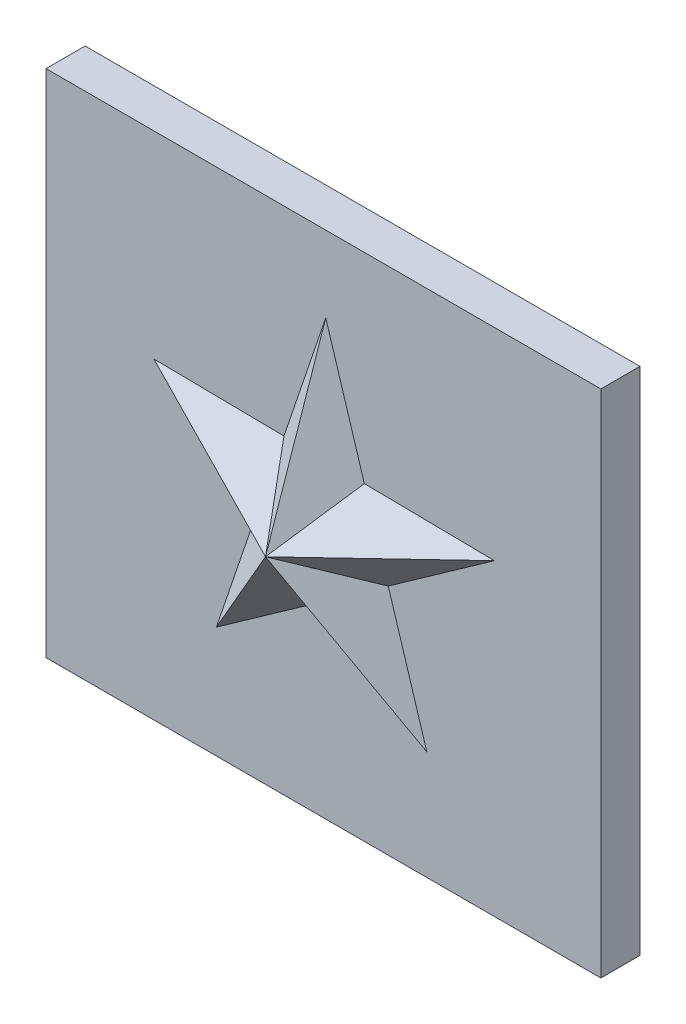
ISO-10303-21;
HEADER;
FILE_DESCRIPTION(('STEP AP214'),'2;1');
FILE_NAME('part.step','',(''),(''),'','','');
FILE_SCHEMA(('AUTOMOTIVE_DESIGN { 1 0 10303 214 1 1 1 1 }'));
ENDSEC;
DATA;
#1=APPLICATION_CONTEXT('core data for automotive mechanical design processes');
#2=APPLICATION_PROTOCOL_DEFINITION('international standard','automotive_design',2000,#1);
#3=PRODUCT_CONTEXT('',#1,'mechanical');
#4=PRODUCT('Part','Part','',(#3));
#5=PRODUCT_RELATED_PRODUCT_CATEGORY('part','',(#4));
#6=PRODUCT_DEFINITION_FORMATION('','',#4);
#7=PRODUCT_DEFINITION_CONTEXT('part definition',#1,'design');
#8=PRODUCT_DEFINITION('design','',#6,#7);
#9=PRODUCT_DEFINITION_SHAPE('','',#8);
#10=(LENGTH_UNIT() NAMED_UNIT(*) SI_UNIT(.MILLI.,.METRE.));
#11=(NAMED_UNIT(*) PLANE_ANGLE_UNIT() SI_UNIT($,.RADIAN.));
#12=(NAMED_UNIT(*) SI_UNIT($,.STERADIAN.) SOLID_ANGLE_UNIT());
#13=UNCERTAINTY_MEASURE_WITH_UNIT(LENGTH_MEASURE(1.E-05),#10,'distance_accuracy_value','');
#14=(GEOMETRIC_REPRESENTATION_CONTEXT(3) GLOBAL_UNCERTAINTY_ASSIGNED_CONTEXT((#13)) GLOBAL_UNIT_ASSIGNED_CONTEXT((#10,
#11,#12)) REPRESENTATION_CONTEXT('',''));
#15=CARTESIAN_POINT('',(0.,0.,0.));
#16=DIRECTION('',(0.,0.,1.));
#17=DIRECTION('',(1.,0.,0.));
#18=AXIS2_PLACEMENT_3D('',#15,#16,#17);
#19=CARTESIAN_POINT('',(2.11990190585049,0.658629289425786,2.11977728970235));
#20=DIRECTION('',(-0.690656187675904,-0.21457898257986,-0.690615588196486));
#21=DIRECTION('',(-0.707085997015318,0.,0.70712756474688));
#22=AXIS2_PLACEMENT_3D('',#19,#20,#21);
#23=PLANE('',#22);
#24=DIRECTION('',(-0.01229729274159,-0.951343477299267,0.307886935077417));
#25=VECTOR('',#24,1.);
#26=CARTESIAN_POINT('',(0.177515276309693,13.7329413706685,0.));
#27=LINE('',#26,#25);
#28=CARTESIAN_POINT('',(0.177515276309692,13.7329413706685,0.));
#29=VERTEX_POINT('',#28);
#30=CARTESIAN_POINT('',(0.,0.,4.44444444));
#31=VERTEX_POINT('',#30);
#32=EDGE_CURVE('E400',#29,#31,#27,.T.);
#33=ORIENTED_EDGE('',*,*,#32,.T.);
#34=DIRECTION('',(-0.456413605920561,-0.611421652011181,0.646413322714274));
#35=VECTOR('',#34,1.);
#36=CARTESIAN_POINT('',(3.13809267521954,4.2038576036247,0.));
#37=LINE('',#36,#35);
#38=CARTESIAN_POINT('',(3.13809267521954,4.2038576036247,0.));
#39=VERTEX_POINT('',#38);
#40=EDGE_CURVE('E65',#39,#31,#37,.T.);
#41=ORIENTED_EDGE('',*,*,#40,.F.);
#42=DIRECTION('',(-0.296698624658093,0.954971165075677,0.));
#43=VECTOR('',#42,1.);
#44=CARTESIAN_POINT('',(3.13809267521954,4.2038576036247,0.));
#45=LINE('',#44,#43);
#46=EDGE_CURVE('E401',#39,#29,#45,.T.);
#47=ORIENTED_EDGE('',*,*,#46,.T.);
#48=EDGE_LOOP('',(#33,#41,#47));
#49=FACE_BOUND('',#48,.T.);
#50=ADVANCED_FACE('F46',(#49),#23,.F.);
#51=CARTESIAN_POINT('',(0.0286920377843989,2.21967416489128,2.11977728970235));
#52=DIRECTION('',(-0.00934775961950741,-0.7231616200616,-0.690615588196486));
#53=DIRECTION('',(0.,0.690645763379698,-0.723193217284063));
#54=AXIS2_PLACEMENT_3D('',#51,#52,#53);
#55=PLANE('',#54);
#56=ORIENTED_EDGE('',*,*,#40,.T.);
#57=DIRECTION('',(-0.908581485762314,-0.282285881578552,0.307886935077417));
#58=VECTOR('',#57,1.);
#59=CARTESIAN_POINT('',(13.1156586156144,4.07488520601509,0.));
#60=LINE('',#59,#58);
#61=CARTESIAN_POINT('',(13.1156586156144,4.07488520601509,0.));
#62=VERTEX_POINT('',#61);
#63=EDGE_CURVE('E12',#62,#31,#60,.T.);
#64=ORIENTED_EDGE('',*,*,#63,.F.);
#65=DIRECTION('',(-0.999916466646222,0.0129251587895385,0.));
#66=VECTOR('',#65,1.);
#67=CARTESIAN_POINT('',(3.13809267521954,4.2038576036247,0.));
#68=LINE('',#67,#66);
#69=EDGE_CURVE('E309',#62,#39,#68,.T.);
#70=ORIENTED_EDGE('',*,*,#69,.T.);
#71=EDGE_LOOP('',(#56,#64,#70));
#72=FACE_BOUND('',#71,.T.);
#73=ADVANCED_FACE('F315',(#72),#55,.F.);
#74=CARTESIAN_POINT('',(-2.10216925129323,0.713204788427065,2.11977728970235));
#75=DIRECTION('',(0.684878954512385,-0.232359477977647,-0.690615588196486));
#76=DIRECTION('',(-0.710049663513221,0.,-0.704151599689131));
#77=AXIS2_PLACEMENT_3D('',#74,#75,#76);
#78=PLANE('',#77);
#79=DIRECTION('',(0.440456985655778,-0.623014815236778,0.646413322714274));
#80=VECTOR('',#79,1.);
#81=CARTESIAN_POINT('',(-3.02838220093782,4.28356692895801,0.));
#82=LINE('',#81,#80);
#83=CARTESIAN_POINT('',(-3.02838220093782,4.28356692895801,0.));
#84=VERTEX_POINT('',#83);
#85=EDGE_CURVE('E341',#84,#31,#82,.T.);
#86=ORIENTED_EDGE('',*,*,#85,.T.);
#87=ORIENTED_EDGE('',*,*,#32,.F.);
#88=DIRECTION('',(-0.321283737639973,-0.946982977633753,0.));
#89=VECTOR('',#88,1.);
#90=CARTESIAN_POINT('',(0.177515276309693,13.7329413706685,0.));
#91=LINE('',#90,#89);
#92=EDGE_CURVE('E404',#29,#84,#91,.T.);
#93=ORIENTED_EDGE('',*,*,#92,.T.);
#94=EDGE_LOOP('',(#86,#87,#93));
#95=FACE_BOUND('',#94,.T.);
#96=ADVANCED_FACE('F325',(#95),#78,.F.);
#97=CARTESIAN_POINT('',(0.0286920377843992,2.21967416489128,2.11977728970235));
#98=DIRECTION('',(-0.00934775961950748,-0.7231616200616,-0.690615588196486));
#99=DIRECTION('',(0.,0.690645763379698,-0.723193217284063));
#100=AXIS2_PLACEMENT_3D('',#97,#98,#99);
#101=PLANE('',#100);
#102=DIRECTION('',(0.900981340878404,-0.305676722367909,0.307886935077417));
#103=VECTOR('',#102,1.);
#104=CARTESIAN_POINT('',(-13.0059481413327,4.41253932656762,0.));
#105=LINE('',#104,#103);
#106=CARTESIAN_POINT('',(-13.0059481413327,4.41253932656762,0.));
#107=VERTEX_POINT('',#106);
#108=EDGE_CURVE('E349',#107,#31,#105,.T.);
#109=ORIENTED_EDGE('',*,*,#108,.T.);
#110=ORIENTED_EDGE('',*,*,#85,.F.);
#111=DIRECTION('',(-0.999916466646222,0.0129251587895386,0.));
#112=VECTOR('',#111,1.);
#113=CARTESIAN_POINT('',(-13.0059481413327,4.41253932656762,0.));
#114=LINE('',#113,#112);
#115=EDGE_CURVE('E357',#84,#107,#114,.T.);
#116=ORIENTED_EDGE('',*,*,#115,.T.);
#117=EDGE_LOOP('',(#109,#110,#116));
#118=FACE_BOUND('',#117,.T.);
#119=ADVANCED_FACE('F331',(#118),#101,.F.);
#120=CARTESIAN_POINT('',(-1.32790408518854,-1.77888936470418,2.11977728970235));
#121=DIRECTION('',(0.432626231687655,0.579555565063231,-0.690615588196486));
#122=DIRECTION('',(0.,0.766011519703359,0.642826844244817));
#123=AXIS2_PLACEMENT_3D('',#120,#121,#122);
#124=PLANE('',#123);
#125=DIRECTION('',(0.728630993638157,0.226377320700117,0.646413322714275));
#126=VECTOR('',#125,1.);
#127=CARTESIAN_POINT('',(-5.00973580632432,-1.55646764844365,0.));
#128=LINE('',#127,#126);
#129=CARTESIAN_POINT('',(-5.00973580632433,-1.55646764844365,0.));
#130=VERTEX_POINT('',#129);
#131=EDGE_CURVE('E368',#130,#31,#128,.T.);
#132=ORIENTED_EDGE('',*,*,#131,.T.);
#133=ORIENTED_EDGE('',*,*,#108,.F.);
#134=DIRECTION('',(0.801352196752115,-0.598192825734779,0.));
#135=VECTOR('',#134,1.);
#136=CARTESIAN_POINT('',(-13.0059481413327,4.41253932656762,0.));
#137=LINE('',#136,#135);
#138=EDGE_CURVE('E375',#107,#130,#137,.T.);
#139=ORIENTED_EDGE('',*,*,#138,.T.);
#140=EDGE_LOOP('',(#132,#133,#139));
#141=FACE_BOUND('',#140,.T.);
#142=ADVANCED_FACE('F381',(#141),#124,.F.);
#143=CARTESIAN_POINT('',(-2.10216925129323,0.713204788427065,2.11977728970235));
#144=DIRECTION('',(0.684878954512385,-0.232359477977647,-0.690615588196486));
#145=DIRECTION('',(-0.710049663513221,0.,-0.704151599689131));
#146=AXIS2_PLACEMENT_3D('',#143,#144,#145);
#147=PLANE('',#146);
#148=DIRECTION('',(0.569134384633898,0.762424873306235,0.307886935077417));
#149=VECTOR('',#148,1.);
#150=CARTESIAN_POINT('',(-8.21563328357183,-11.0058420901542,0.));
#151=LINE('',#150,#149);
#152=CARTESIAN_POINT('',(-8.21563328357183,-11.0058420901542,0.));
#153=VERTEX_POINT('',#152);
#154=EDGE_CURVE('E242',#153,#31,#151,.T.);
#155=ORIENTED_EDGE('',*,*,#154,.T.);
#156=ORIENTED_EDGE('',*,*,#131,.F.);
#157=DIRECTION('',(-0.321283737639973,-0.946982977633753,0.));
#158=VECTOR('',#157,1.);
#159=CARTESIAN_POINT('',(-5.00973580632432,-1.55646764844365,0.));
#160=LINE('',#159,#158);
#161=EDGE_CURVE('E407',#130,#153,#160,.T.);
#162=ORIENTED_EDGE('',*,*,#161,.T.);
#163=EDGE_LOOP('',(#155,#156,#162));
#164=FACE_BOUND('',#163,.T.);
#165=ADVANCED_FACE('F255',(#164),#147,.F.);
#166=CARTESIAN_POINT('',(1.28147939284688,-1.81261887803996,2.11977728970235));
#167=DIRECTION('',(-0.417501238904627,0.590544515555874,-0.690615588196487));
#168=DIRECTION('',(0.,0.760023726262173,0.649895326586184));
#169=AXIS2_PLACEMENT_3D('',#166,#167,#168);
#170=PLANE('',#169);
#171=DIRECTION('',(0.00986173366921,0.762923693711586,0.646413322714274));
#172=VECTOR('',#171,1.);
#173=CARTESIAN_POINT('',(-0.0678048020279662,-5.24551683808581,0.));
#174=LINE('',#173,#172);
#175=CARTESIAN_POINT('',(-0.0678048020279662,-5.24551683808581,0.));
#176=VERTEX_POINT('',#175);
#177=EDGE_CURVE('E277',#176,#31,#174,.T.);
#178=ORIENTED_EDGE('',*,*,#177,.T.);
#179=ORIENTED_EDGE('',*,*,#154,.F.);
#180=DIRECTION('',(0.816546632192173,0.577279479503316,0.));
#181=VECTOR('',#180,1.);
#182=CARTESIAN_POINT('',(-0.0678048020279662,-5.24551683808581,0.));
#183=LINE('',#182,#181);
#184=EDGE_CURVE('E237',#153,#176,#183,.T.);
#185=ORIENTED_EDGE('',*,*,#184,.T.);
#186=EDGE_LOOP('',(#178,#179,#185));
#187=FACE_BOUND('',#186,.T.);
#188=ADVANCED_FACE('F244',(#187),#170,.F.);
#189=CARTESIAN_POINT('',(-1.32790408518853,-1.77888936470418,2.11977728970235));
#190=DIRECTION('',(0.432626231687655,0.579555565063231,-0.690615588196486));
#191=DIRECTION('',(0.,0.766011519703359,0.642826844244817));
#192=AXIS2_PLACEMENT_3D('',#189,#190,#191);
#193=PLANE('',#192);
#194=DIRECTION('',(-0.549236947008399,0.776881207939494,0.307886935077417));
#195=VECTOR('',#194,1.);
#196=CARTESIAN_POINT('',(7.92840753298043,-11.2145238130971,0.));
#197=LINE('',#196,#195);
#198=CARTESIAN_POINT('',(7.92840753298043,-11.2145238130971,0.));
#199=VERTEX_POINT('',#198);
#200=EDGE_CURVE('E269',#199,#31,#197,.T.);
#201=ORIENTED_EDGE('',*,*,#200,.T.);
#202=ORIENTED_EDGE('',*,*,#177,.F.);
#203=DIRECTION('',(0.801352196752115,-0.59819282573478,0.));
#204=VECTOR('',#203,1.);
#205=CARTESIAN_POINT('',(-0.0678048020279662,-5.24551683808581,0.));
#206=LINE('',#205,#204);
#207=EDGE_CURVE('E151',#176,#199,#206,.T.);
#208=ORIENTED_EDGE('',*,*,#207,.T.);
#209=EDGE_LOOP('',(#201,#202,#208));
#210=FACE_BOUND('',#209,.T.);
#211=ADVANCED_FACE('F254',(#210),#193,.F.);
#212=CARTESIAN_POINT('',(2.11990190585048,0.658629289425786,2.11977728970235));
#213=DIRECTION('',(-0.690656187675904,-0.21457898257986,-0.690615588196486));
#214=DIRECTION('',(-0.707085997015318,0.,0.70712756474688));
#215=AXIS2_PLACEMENT_3D('',#212,#213,#214);
#216=PLANE('',#215);
#217=DIRECTION('',(-0.722536107042586,0.245135452836258,0.646413322714274));
#218=VECTOR('',#217,1.);
#219=CARTESIAN_POINT('',(4.96783013407058,-1.68544004605326,0.));
#220=LINE('',#219,#218);
#221=CARTESIAN_POINT('',(4.96783013407058,-1.68544004605326,0.));
#222=VERTEX_POINT('',#221);
#223=EDGE_CURVE('E57',#222,#31,#220,.T.);
#224=ORIENTED_EDGE('',*,*,#223,.T.);
#225=ORIENTED_EDGE('',*,*,#200,.F.);
#226=DIRECTION('',(-0.296698624658093,0.954971165075677,0.));
#227=VECTOR('',#226,1.);
#228=CARTESIAN_POINT('',(7.92840753298043,-11.2145238130971,0.));
#229=LINE('',#228,#227);
#230=EDGE_CURVE('E154',#199,#222,#229,.T.);
#231=ORIENTED_EDGE('',*,*,#230,.T.);
#232=EDGE_LOOP('',(#224,#225,#231));
#233=FACE_BOUND('',#232,.T.);
#234=ADVANCED_FACE('F260',(#233),#216,.F.);
#235=CARTESIAN_POINT('',(1.28147939284688,-1.81261887803996,2.11977728970235));
#236=DIRECTION('',(-0.417501238904627,0.590544515555874,-0.690615588196487));
#237=DIRECTION('',(0.,0.760023726262172,0.649895326586184));
#238=AXIS2_PLACEMENT_3D('',#235,#236,#237);
#239=PLANE('',#238);
#240=ORIENTED_EDGE('',*,*,#63,.T.);
#241=ORIENTED_EDGE('',*,*,#223,.F.);
#242=DIRECTION('',(0.816546632192173,0.577279479503317,0.));
#243=VECTOR('',#242,1.);
#244=CARTESIAN_POINT('',(13.1156586156144,4.07488520601509,0.));
#245=LINE('',#244,#243);
#246=EDGE_CURVE('E51',#222,#62,#245,.T.);
#247=ORIENTED_EDGE('',*,*,#246,.T.);
#248=EDGE_LOOP('',(#240,#241,#247));
#249=FACE_BOUND('',#248,.T.);
#250=ADVANCED_FACE('F48',(#249),#239,.F.);
#251=CARTESIAN_POINT('',(21.275,-19.56,-3.));
#252=DIRECTION('',(-1.,0.,0.));
#253=DIRECTION('',(0.,0.,1.));
#254=AXIS2_PLACEMENT_3D('',#251,#252,#253);
#255=PLANE('',#254);
#256=DIRECTION('',(0.,-1.,0.));
#257=VECTOR('',#256,1.);
#258=CARTESIAN_POINT('',(21.275,-19.56,0.));
#259=LINE('',#258,#257);
#260=CARTESIAN_POINT('',(21.275,19.56,0.));
#261=VERTEX_POINT('',#260);
#262=CARTESIAN_POINT('',(21.275,-19.56,0.));
#263=VERTEX_POINT('',#262);
#264=EDGE_CURVE('E150',#261,#263,#259,.T.);
#265=ORIENTED_EDGE('',*,*,#264,.T.);
#266=DIRECTION('',(0.,0.,1.));
#267=VECTOR('',#266,1.);
#268=CARTESIAN_POINT('',(21.275,-19.56,-3.));
#269=LINE('',#268,#267);
#270=CARTESIAN_POINT('',(21.275,-19.56,-3.));
#271=VERTEX_POINT('',#270);
#272=EDGE_CURVE('E130',#271,#263,#269,.T.);
#273=ORIENTED_EDGE('',*,*,#272,.F.);
#274=DIRECTION('',(0.,-1.,0.));
#275=VECTOR('',#274,1.);
#276=CARTESIAN_POINT('',(21.275,-19.56,-3.));
#277=LINE('',#276,#275);
#278=CARTESIAN_POINT('',(21.275,19.56,-3.));
#279=VERTEX_POINT('',#278);
#280=EDGE_CURVE('E137',#279,#271,#277,.T.);
#281=ORIENTED_EDGE('',*,*,#280,.F.);
#282=DIRECTION('',(0.,0.,1.));
#283=VECTOR('',#282,1.);
#284=CARTESIAN_POINT('',(21.275,19.56,-3.));
#285=LINE('',#284,#283);
#286=EDGE_CURVE('E553',#279,#261,#285,.T.);
#287=ORIENTED_EDGE('',*,*,#286,.T.);
#288=EDGE_LOOP('',(#265,#273,#281,#287));
#289=FACE_BOUND('',#288,.T.);
#290=ADVANCED_FACE('F148',(#289),#255,.F.);
#291=CARTESIAN_POINT('',(-21.275,-19.56,-3.));
#292=DIRECTION('',(0.,1.,0.));
#293=DIRECTION('',(-1.,0.,0.));
#294=AXIS2_PLACEMENT_3D('',#291,#292,#293);
#295=PLANE('',#294);
#296=DIRECTION('',(-1.,0.,0.));
#297=VECTOR('',#296,1.);
#298=CARTESIAN_POINT('',(-21.275,-19.56,0.));
#299=LINE('',#298,#297);
#300=CARTESIAN_POINT('',(-21.275,-19.56,0.));
#301=VERTEX_POINT('',#300);
#302=EDGE_CURVE('E551',#263,#301,#299,.T.);
#303=ORIENTED_EDGE('',*,*,#302,.T.);
#304=DIRECTION('',(0.,0.,1.));
#305=VECTOR('',#304,1.);
#306=CARTESIAN_POINT('',(-21.275,-19.56,-3.));
#307=LINE('',#306,#305);
#308=CARTESIAN_POINT('',(-21.275,-19.56,-3.));
#309=VERTEX_POINT('',#308);
#310=EDGE_CURVE('E133',#309,#301,#307,.T.);
#311=ORIENTED_EDGE('',*,*,#310,.F.);
#312=DIRECTION('',(-1.,0.,0.));
#313=VECTOR('',#312,1.);
#314=CARTESIAN_POINT('',(-21.275,-19.56,-3.));
#315=LINE('',#314,#313);
#316=EDGE_CURVE('E126',#271,#309,#315,.T.);
#317=ORIENTED_EDGE('',*,*,#316,.F.);
#318=ORIENTED_EDGE('',*,*,#272,.T.);
#319=EDGE_LOOP('',(#303,#311,#317,#318));
#320=FACE_BOUND('',#319,.T.);
#321=ADVANCED_FACE('F128',(#320),#295,.F.);
#322=CARTESIAN_POINT('',(-21.275,19.56,-3.));
#323=DIRECTION('',(1.,0.,0.));
#324=DIRECTION('',(0.,1.,0.));
#325=AXIS2_PLACEMENT_3D('',#322,#323,#324);
#326=PLANE('',#325);
#327=DIRECTION('',(0.,1.,0.));
#328=VECTOR('',#327,1.);
#329=CARTESIAN_POINT('',(-21.275,19.56,0.));
#330=LINE('',#329,#328);
#331=CARTESIAN_POINT('',(-21.275,19.56,0.));
#332=VERTEX_POINT('',#331);
#333=EDGE_CURVE('E547',#301,#332,#330,.T.);
#334=ORIENTED_EDGE('',*,*,#333,.T.);
#335=DIRECTION('',(0.,0.,1.));
#336=VECTOR('',#335,1.);
#337=CARTESIAN_POINT('',(-21.275,19.56,-3.));
#338=LINE('',#337,#336);
#339=CARTESIAN_POINT('',(-21.275,19.56,-3.));
#340=VERTEX_POINT('',#339);
#341=EDGE_CURVE('E156',#340,#332,#338,.T.);
#342=ORIENTED_EDGE('',*,*,#341,.F.);
#343=DIRECTION('',(0.,1.,0.));
#344=VECTOR('',#343,1.);
#345=CARTESIAN_POINT('',(-21.275,19.56,-3.));
#346=LINE('',#345,#344);
#347=EDGE_CURVE('E136',#309,#340,#346,.T.);
#348=ORIENTED_EDGE('',*,*,#347,.F.);
#349=ORIENTED_EDGE('',*,*,#310,.T.);
#350=EDGE_LOOP('',(#334,#342,#348,#349));
#351=FACE_BOUND('',#350,.T.);
#352=ADVANCED_FACE('F464',(#351),#326,.F.);
#353=CARTESIAN_POINT('',(21.275,19.56,-3.));
#354=DIRECTION('',(0.,-1.,0.));
#355=DIRECTION('',(0.,0.,-1.));
#356=AXIS2_PLACEMENT_3D('',#353,#354,#355);
#357=PLANE('',#356);
#358=DIRECTION('',(1.,0.,0.));
#359=VECTOR('',#358,1.);
#360=CARTESIAN_POINT('',(21.275,19.56,0.));
#361=LINE('',#360,#359);
#362=EDGE_CURVE('E146',#332,#261,#361,.T.);
#363=ORIENTED_EDGE('',*,*,#362,.T.);
#364=ORIENTED_EDGE('',*,*,#286,.F.);
#365=DIRECTION('',(1.,0.,0.));
#366=VECTOR('',#365,1.);
#367=CARTESIAN_POINT('',(21.275,19.56,-3.));
#368=LINE('',#367,#366);
#369=EDGE_CURVE('E142',#340,#279,#368,.T.);
#370=ORIENTED_EDGE('',*,*,#369,.F.);
#371=ORIENTED_EDGE('',*,*,#341,.T.);
#372=EDGE_LOOP('',(#363,#364,#370,#371));
#373=FACE_BOUND('',#372,.T.);
#374=ADVANCED_FACE('F175',(#373),#357,.F.);
#375=CARTESIAN_POINT('',(0.,0.,-3.));
#376=DIRECTION('',(0.,0.,1.));
#377=DIRECTION('',(1.,0.,0.));
#378=AXIS2_PLACEMENT_3D('',#375,#376,#377);
#379=PLANE('',#378);
#380=ORIENTED_EDGE('',*,*,#280,.T.);
#381=ORIENTED_EDGE('',*,*,#316,.T.);
#382=ORIENTED_EDGE('',*,*,#347,.T.);
#383=ORIENTED_EDGE('',*,*,#369,.T.);
#384=EDGE_LOOP('',(#380,#381,#382,#383));
#385=FACE_BOUND('',#384,.T.);
#386=ADVANCED_FACE('F140',(#385),#379,.F.);
#387=CARTESIAN_POINT('',(0.,0.,0.));
#388=DIRECTION('',(0.,0.,1.));
#389=DIRECTION('',(1.,0.,0.));
#390=AXIS2_PLACEMENT_3D('',#387,#388,#389);
#391=PLANE('',#390);
#392=ORIENTED_EDGE('',*,*,#230,.F.);
#393=ORIENTED_EDGE('',*,*,#207,.F.);
#394=ORIENTED_EDGE('',*,*,#184,.F.);
#395=ORIENTED_EDGE('',*,*,#161,.F.);
#396=ORIENTED_EDGE('',*,*,#138,.F.);
#397=ORIENTED_EDGE('',*,*,#115,.F.);
#398=ORIENTED_EDGE('',*,*,#92,.F.);
#399=ORIENTED_EDGE('',*,*,#46,.F.);
#400=ORIENTED_EDGE('',*,*,#69,.F.);
#401=ORIENTED_EDGE('',*,*,#246,.F.);
#402=EDGE_LOOP('',(#392,#393,#394,#395,#396,#397,#398,#399,#400,#401));
#403=FACE_BOUND('',#402,.T.);
#404=ORIENTED_EDGE('',*,*,#264,.F.);
#405=ORIENTED_EDGE('',*,*,#362,.F.);
#406=ORIENTED_EDGE('',*,*,#333,.F.);
#407=ORIENTED_EDGE('',*,*,#302,.F.);
#408=EDGE_LOOP('',(#404,#405,#406,#407));
#409=FACE_BOUND('',#408,.T.);
#410=ADVANCED_FACE('F165',(#403,#409),#391,.T.);
#411=CLOSED_SHELL('',(#50,#73,#96,#119,#142,#165,#188,#211,#234,#250,#290,#321,#352,#374,#386,#410));
#412=MANIFOLD_SOLID_BREP('B2',#411);
#413=ADVANCED_BREP_SHAPE_REPRESENTATION('',(#18,#412),#14);
#414=SHAPE_DEFINITION_REPRESENTATION(#9,#413);
ENDSEC;
END-ISO-10303-21;
